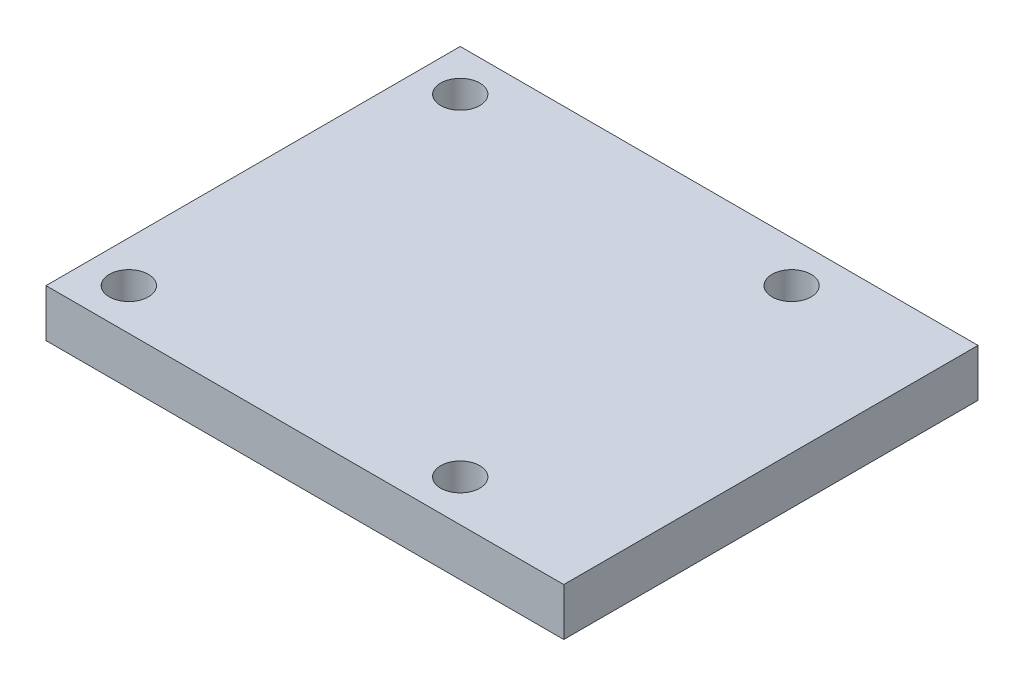
ISO-10303-21;
HEADER;
FILE_DESCRIPTION(('STEP AP214'),'2;1');
FILE_NAME('part.step','',(''),(''),'','','');
FILE_SCHEMA(('AUTOMOTIVE_DESIGN { 1 0 10303 214 1 1 1 1 }'));
ENDSEC;
DATA;
#1=APPLICATION_CONTEXT('core data for automotive mechanical design processes');
#2=APPLICATION_PROTOCOL_DEFINITION('international standard','automotive_design',2000,#1);
#3=PRODUCT_CONTEXT('',#1,'mechanical');
#4=PRODUCT('Part','Part','',(#3));
#5=PRODUCT_RELATED_PRODUCT_CATEGORY('part','',(#4));
#6=PRODUCT_DEFINITION_FORMATION('','',#4);
#7=PRODUCT_DEFINITION_CONTEXT('part definition',#1,'design');
#8=PRODUCT_DEFINITION('design','',#6,#7);
#9=PRODUCT_DEFINITION_SHAPE('','',#8);
#10=(LENGTH_UNIT() NAMED_UNIT(*) SI_UNIT(.MILLI.,.METRE.));
#11=(NAMED_UNIT(*) PLANE_ANGLE_UNIT() SI_UNIT($,.RADIAN.));
#12=(NAMED_UNIT(*) SI_UNIT($,.STERADIAN.) SOLID_ANGLE_UNIT());
#13=UNCERTAINTY_MEASURE_WITH_UNIT(LENGTH_MEASURE(1.E-05),#10,'distance_accuracy_value','');
#14=(GEOMETRIC_REPRESENTATION_CONTEXT(3) GLOBAL_UNCERTAINTY_ASSIGNED_CONTEXT((#13)) GLOBAL_UNIT_ASSIGNED_CONTEXT((#10,
#11,#12)) REPRESENTATION_CONTEXT('',''));
#15=CARTESIAN_POINT('',(0.,0.,0.));
#16=DIRECTION('',(0.,0.,1.));
#17=DIRECTION('',(1.,0.,0.));
#18=AXIS2_PLACEMENT_3D('',#15,#16,#17);
#19=CARTESIAN_POINT('',(0.,0.,0.));
#20=DIRECTION('',(0.,-1.,0.));
#21=DIRECTION('',(0.,0.,-1.));
#22=AXIS2_PLACEMENT_3D('',#19,#20,#21);
#23=PLANE('',#22);
#24=CARTESIAN_POINT('',(-13.335,0.,-10.16));
#25=DIRECTION('',(0.,1.,0.));
#26=DIRECTION('',(0.,0.,1.));
#27=AXIS2_PLACEMENT_3D('',#24,#25,#26);
#28=CIRCLE('',#27,1.2);
#29=CARTESIAN_POINT('',(-13.335,0.,-8.95999999999999));
#30=VERTEX_POINT('',#29);
#31=EDGE_CURVE('E152',#30,#30,#28,.T.);
#32=ORIENTED_EDGE('',*,*,#31,.T.);
#33=EDGE_LOOP('',(#32));
#34=FACE_BOUND('',#33,.T.);
#35=DIRECTION('',(0.,0.,-1.));
#36=VECTOR('',#35,1.);
#37=CARTESIAN_POINT('',(15.875,0.,12.7));
#38=LINE('',#37,#36);
#39=CARTESIAN_POINT('',(15.875,0.,12.7));
#40=VERTEX_POINT('',#39);
#41=CARTESIAN_POINT('',(15.875,0.,-12.7));
#42=VERTEX_POINT('',#41);
#43=EDGE_CURVE('E108',#40,#42,#38,.T.);
#44=ORIENTED_EDGE('',*,*,#43,.F.);
#45=DIRECTION('',(1.,0.,0.));
#46=VECTOR('',#45,1.);
#47=CARTESIAN_POINT('',(-15.875,0.,12.7));
#48=LINE('',#47,#46);
#49=CARTESIAN_POINT('',(-15.875,0.,12.7));
#50=VERTEX_POINT('',#49);
#51=EDGE_CURVE('E80',#50,#40,#48,.T.);
#52=ORIENTED_EDGE('',*,*,#51,.F.);
#53=DIRECTION('',(0.,0.,1.));
#54=VECTOR('',#53,1.);
#55=CARTESIAN_POINT('',(-15.875,0.,12.7));
#56=LINE('',#55,#54);
#57=CARTESIAN_POINT('',(-15.875,0.,-12.7));
#58=VERTEX_POINT('',#57);
#59=EDGE_CURVE('E74',#58,#50,#56,.T.);
#60=ORIENTED_EDGE('',*,*,#59,.F.);
#61=DIRECTION('',(-1.,0.,0.));
#62=VECTOR('',#61,1.);
#63=CARTESIAN_POINT('',(-15.875,0.,-12.7));
#64=LINE('',#63,#62);
#65=EDGE_CURVE('E97',#42,#58,#64,.T.);
#66=ORIENTED_EDGE('',*,*,#65,.F.);
#67=EDGE_LOOP('',(#44,#52,#60,#66));
#68=FACE_BOUND('',#67,.T.);
#69=CARTESIAN_POINT('',(-13.335,0.,10.16));
#70=DIRECTION('',(0.,1.,0.));
#71=DIRECTION('',(0.,0.,1.));
#72=AXIS2_PLACEMENT_3D('',#69,#70,#71);
#73=CIRCLE('',#72,1.2);
#74=CARTESIAN_POINT('',(-13.335,0.,11.36));
#75=VERTEX_POINT('',#74);
#76=EDGE_CURVE('E112',#75,#75,#73,.T.);
#77=ORIENTED_EDGE('',*,*,#76,.T.);
#78=EDGE_LOOP('',(#77));
#79=FACE_BOUND('',#78,.T.);
#80=CARTESIAN_POINT('',(6.98499999999999,0.,10.16));
#81=DIRECTION('',(0.,1.,0.));
#82=DIRECTION('',(0.,0.,1.));
#83=AXIS2_PLACEMENT_3D('',#80,#81,#82);
#84=CIRCLE('',#83,1.2);
#85=CARTESIAN_POINT('',(6.98499999999999,0.,11.36));
#86=VERTEX_POINT('',#85);
#87=EDGE_CURVE('E136',#86,#86,#84,.T.);
#88=ORIENTED_EDGE('',*,*,#87,.T.);
#89=EDGE_LOOP('',(#88));
#90=FACE_BOUND('',#89,.T.);
#91=CARTESIAN_POINT('',(6.98499999999999,0.,-10.16));
#92=DIRECTION('',(0.,1.,0.));
#93=DIRECTION('',(0.,0.,1.));
#94=AXIS2_PLACEMENT_3D('',#91,#92,#93);
#95=CIRCLE('',#94,1.2);
#96=CARTESIAN_POINT('',(6.98499999999999,0.,-8.95999999999999));
#97=VERTEX_POINT('',#96);
#98=EDGE_CURVE('E144',#97,#97,#95,.T.);
#99=ORIENTED_EDGE('',*,*,#98,.T.);
#100=EDGE_LOOP('',(#99));
#101=FACE_BOUND('',#100,.T.);
#102=ADVANCED_FACE('F39',(#34,#68,#79,#90,#101),#23,.T.);
#103=CARTESIAN_POINT('',(15.875,2.921,12.7));
#104=DIRECTION('',(-1.,0.,0.));
#105=DIRECTION('',(0.,0.,1.));
#106=AXIS2_PLACEMENT_3D('',#103,#104,#105);
#107=PLANE('',#106);
#108=ORIENTED_EDGE('',*,*,#43,.T.);
#109=DIRECTION('',(0.,-1.,0.));
#110=VECTOR('',#109,1.);
#111=CARTESIAN_POINT('',(15.875,2.921,-12.7));
#112=LINE('',#111,#110);
#113=CARTESIAN_POINT('',(15.875,2.921,-12.7));
#114=VERTEX_POINT('',#113);
#115=EDGE_CURVE('E11',#114,#42,#112,.T.);
#116=ORIENTED_EDGE('',*,*,#115,.F.);
#117=DIRECTION('',(0.,0.,-1.));
#118=VECTOR('',#117,1.);
#119=CARTESIAN_POINT('',(15.875,2.921,12.7));
#120=LINE('',#119,#118);
#121=CARTESIAN_POINT('',(15.875,2.921,12.7));
#122=VERTEX_POINT('',#121);
#123=EDGE_CURVE('E92',#122,#114,#120,.T.);
#124=ORIENTED_EDGE('',*,*,#123,.F.);
#125=DIRECTION('',(0.,-1.,0.));
#126=VECTOR('',#125,1.);
#127=CARTESIAN_POINT('',(15.875,2.921,12.7));
#128=LINE('',#127,#126);
#129=EDGE_CURVE('E104',#122,#40,#128,.T.);
#130=ORIENTED_EDGE('',*,*,#129,.T.);
#131=EDGE_LOOP('',(#108,#116,#124,#130));
#132=FACE_BOUND('',#131,.T.);
#133=ADVANCED_FACE('F41',(#132),#107,.F.);
#134=CARTESIAN_POINT('',(-15.875,2.921,-12.7));
#135=DIRECTION('',(0.,0.,1.));
#136=DIRECTION('',(1.,0.,0.));
#137=AXIS2_PLACEMENT_3D('',#134,#135,#136);
#138=PLANE('',#137);
#139=ORIENTED_EDGE('',*,*,#65,.T.);
#140=DIRECTION('',(0.,-1.,0.));
#141=VECTOR('',#140,1.);
#142=CARTESIAN_POINT('',(-15.875,2.921,-12.7));
#143=LINE('',#142,#141);
#144=CARTESIAN_POINT('',(-15.875,2.921,-12.7));
#145=VERTEX_POINT('',#144);
#146=EDGE_CURVE('E49',#145,#58,#143,.T.);
#147=ORIENTED_EDGE('',*,*,#146,.F.);
#148=DIRECTION('',(-1.,0.,0.));
#149=VECTOR('',#148,1.);
#150=CARTESIAN_POINT('',(-15.875,2.921,-12.7));
#151=LINE('',#150,#149);
#152=EDGE_CURVE('E87',#114,#145,#151,.T.);
#153=ORIENTED_EDGE('',*,*,#152,.F.);
#154=ORIENTED_EDGE('',*,*,#115,.T.);
#155=EDGE_LOOP('',(#139,#147,#153,#154));
#156=FACE_BOUND('',#155,.T.);
#157=ADVANCED_FACE('F96',(#156),#138,.F.);
#158=CARTESIAN_POINT('',(-15.875,2.921,12.7));
#159=DIRECTION('',(1.,0.,0.));
#160=DIRECTION('',(0.,0.,-1.));
#161=AXIS2_PLACEMENT_3D('',#158,#159,#160);
#162=PLANE('',#161);
#163=ORIENTED_EDGE('',*,*,#59,.T.);
#164=DIRECTION('',(0.,-1.,0.));
#165=VECTOR('',#164,1.);
#166=CARTESIAN_POINT('',(-15.875,2.921,12.7));
#167=LINE('',#166,#165);
#168=CARTESIAN_POINT('',(-15.875,2.921,12.7));
#169=VERTEX_POINT('',#168);
#170=EDGE_CURVE('E99',#169,#50,#167,.T.);
#171=ORIENTED_EDGE('',*,*,#170,.F.);
#172=DIRECTION('',(0.,0.,1.));
#173=VECTOR('',#172,1.);
#174=CARTESIAN_POINT('',(-15.875,2.921,12.7));
#175=LINE('',#174,#173);
#176=EDGE_CURVE('E90',#145,#169,#175,.T.);
#177=ORIENTED_EDGE('',*,*,#176,.F.);
#178=ORIENTED_EDGE('',*,*,#146,.T.);
#179=EDGE_LOOP('',(#163,#171,#177,#178));
#180=FACE_BOUND('',#179,.T.);
#181=ADVANCED_FACE('F100',(#180),#162,.F.);
#182=CARTESIAN_POINT('',(-15.875,2.921,12.7));
#183=DIRECTION('',(0.,0.,-1.));
#184=DIRECTION('',(-1.,0.,0.));
#185=AXIS2_PLACEMENT_3D('',#182,#183,#184);
#186=PLANE('',#185);
#187=ORIENTED_EDGE('',*,*,#51,.T.);
#188=ORIENTED_EDGE('',*,*,#129,.F.);
#189=DIRECTION('',(1.,0.,0.));
#190=VECTOR('',#189,1.);
#191=CARTESIAN_POINT('',(-15.875,2.921,12.7));
#192=LINE('',#191,#190);
#193=EDGE_CURVE('E57',#169,#122,#192,.T.);
#194=ORIENTED_EDGE('',*,*,#193,.F.);
#195=ORIENTED_EDGE('',*,*,#170,.T.);
#196=EDGE_LOOP('',(#187,#188,#194,#195));
#197=FACE_BOUND('',#196,.T.);
#198=ADVANCED_FACE('F122',(#197),#186,.F.);
#199=CARTESIAN_POINT('',(0.,2.921,0.));
#200=DIRECTION('',(0.,-1.,0.));
#201=DIRECTION('',(0.,0.,-1.));
#202=AXIS2_PLACEMENT_3D('',#199,#200,#201);
#203=PLANE('',#202);
#204=CARTESIAN_POINT('',(-13.335,2.921,-10.16));
#205=DIRECTION('',(0.,1.,0.));
#206=DIRECTION('',(0.,0.,1.));
#207=AXIS2_PLACEMENT_3D('',#204,#205,#206);
#208=CIRCLE('',#207,1.2);
#209=CARTESIAN_POINT('',(-13.335,2.921,-8.95999999999999));
#210=VERTEX_POINT('',#209);
#211=EDGE_CURVE('E156',#210,#210,#208,.T.);
#212=ORIENTED_EDGE('',*,*,#211,.F.);
#213=EDGE_LOOP('',(#212));
#214=FACE_BOUND('',#213,.T.);
#215=CARTESIAN_POINT('',(6.98499999999999,2.921,-10.16));
#216=DIRECTION('',(0.,1.,0.));
#217=DIRECTION('',(0.,0.,1.));
#218=AXIS2_PLACEMENT_3D('',#215,#216,#217);
#219=CIRCLE('',#218,1.2);
#220=CARTESIAN_POINT('',(6.98499999999999,2.921,-8.95999999999999));
#221=VERTEX_POINT('',#220);
#222=EDGE_CURVE('E148',#221,#221,#219,.T.);
#223=ORIENTED_EDGE('',*,*,#222,.F.);
#224=EDGE_LOOP('',(#223));
#225=FACE_BOUND('',#224,.T.);
#226=CARTESIAN_POINT('',(6.98499999999999,2.921,10.16));
#227=DIRECTION('',(0.,1.,0.));
#228=DIRECTION('',(0.,0.,1.));
#229=AXIS2_PLACEMENT_3D('',#226,#227,#228);
#230=CIRCLE('',#229,1.2);
#231=CARTESIAN_POINT('',(6.98499999999999,2.921,11.36));
#232=VERTEX_POINT('',#231);
#233=EDGE_CURVE('E140',#232,#232,#230,.T.);
#234=ORIENTED_EDGE('',*,*,#233,.F.);
#235=EDGE_LOOP('',(#234));
#236=FACE_BOUND('',#235,.T.);
#237=CARTESIAN_POINT('',(-13.335,2.921,10.16));
#238=DIRECTION('',(0.,1.,0.));
#239=DIRECTION('',(0.,0.,1.));
#240=AXIS2_PLACEMENT_3D('',#237,#238,#239);
#241=CIRCLE('',#240,1.2);
#242=CARTESIAN_POINT('',(-13.335,2.921,11.36));
#243=VERTEX_POINT('',#242);
#244=EDGE_CURVE('E132',#243,#243,#241,.T.);
#245=ORIENTED_EDGE('',*,*,#244,.F.);
#246=EDGE_LOOP('',(#245));
#247=FACE_BOUND('',#246,.T.);
#248=ORIENTED_EDGE('',*,*,#123,.T.);
#249=ORIENTED_EDGE('',*,*,#152,.T.);
#250=ORIENTED_EDGE('',*,*,#176,.T.);
#251=ORIENTED_EDGE('',*,*,#193,.T.);
#252=EDGE_LOOP('',(#248,#249,#250,#251));
#253=FACE_BOUND('',#252,.T.);
#254=ADVANCED_FACE('F88',(#214,#225,#236,#247,#253),#203,.F.);
#255=CARTESIAN_POINT('',(-13.335,2.921,10.16));
#256=DIRECTION('',(0.,1.,0.));
#257=DIRECTION('',(0.,0.,1.));
#258=AXIS2_PLACEMENT_3D('',#255,#256,#257);
#259=CYLINDRICAL_SURFACE('',#258,1.2);
#260=ORIENTED_EDGE('',*,*,#76,.F.);
#261=EDGE_LOOP('',(#260));
#262=FACE_BOUND('',#261,.T.);
#263=ORIENTED_EDGE('',*,*,#244,.T.);
#264=EDGE_LOOP('',(#263));
#265=FACE_BOUND('',#264,.T.);
#266=ADVANCED_FACE('F165',(#262,#265),#259,.F.);
#267=CARTESIAN_POINT('',(6.98499999999999,2.921,10.16));
#268=DIRECTION('',(0.,1.,0.));
#269=DIRECTION('',(0.,0.,1.));
#270=AXIS2_PLACEMENT_3D('',#267,#268,#269);
#271=CYLINDRICAL_SURFACE('',#270,1.2);
#272=ORIENTED_EDGE('',*,*,#87,.F.);
#273=EDGE_LOOP('',(#272));
#274=FACE_BOUND('',#273,.T.);
#275=ORIENTED_EDGE('',*,*,#233,.T.);
#276=EDGE_LOOP('',(#275));
#277=FACE_BOUND('',#276,.T.);
#278=ADVANCED_FACE('F174',(#274,#277),#271,.F.);
#279=CARTESIAN_POINT('',(6.98499999999999,2.921,-10.16));
#280=DIRECTION('',(0.,1.,0.));
#281=DIRECTION('',(0.,0.,1.));
#282=AXIS2_PLACEMENT_3D('',#279,#280,#281);
#283=CYLINDRICAL_SURFACE('',#282,1.2);
#284=ORIENTED_EDGE('',*,*,#98,.F.);
#285=EDGE_LOOP('',(#284));
#286=FACE_BOUND('',#285,.T.);
#287=ORIENTED_EDGE('',*,*,#222,.T.);
#288=EDGE_LOOP('',(#287));
#289=FACE_BOUND('',#288,.T.);
#290=ADVANCED_FACE('F180',(#286,#289),#283,.F.);
#291=CARTESIAN_POINT('',(-13.335,2.921,-10.16));
#292=DIRECTION('',(0.,1.,0.));
#293=DIRECTION('',(0.,0.,1.));
#294=AXIS2_PLACEMENT_3D('',#291,#292,#293);
#295=CYLINDRICAL_SURFACE('',#294,1.2);
#296=ORIENTED_EDGE('',*,*,#31,.F.);
#297=EDGE_LOOP('',(#296));
#298=FACE_BOUND('',#297,.T.);
#299=ORIENTED_EDGE('',*,*,#211,.T.);
#300=EDGE_LOOP('',(#299));
#301=FACE_BOUND('',#300,.T.);
#302=ADVANCED_FACE('F161',(#298,#301),#295,.F.);
#303=CLOSED_SHELL('',(#102,#133,#157,#181,#198,#254,#266,#278,#290,#302));
#304=MANIFOLD_SOLID_BREP('B2',#303);
#305=ADVANCED_BREP_SHAPE_REPRESENTATION('',(#18,#304),#14);
#306=SHAPE_DEFINITION_REPRESENTATION(#9,#305);
ENDSEC;
END-ISO-10303-21;
